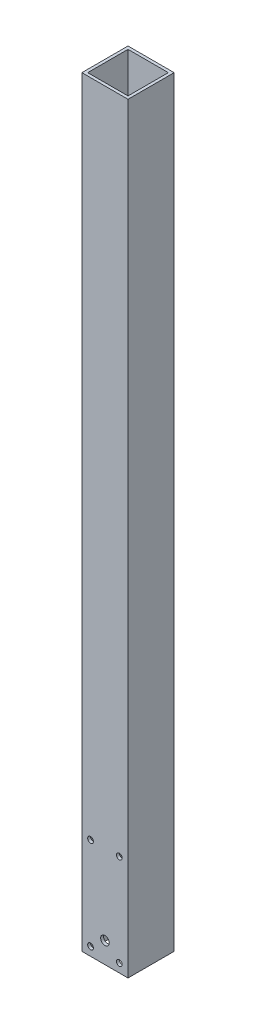
ISO-10303-21;
HEADER;
FILE_DESCRIPTION(('STEP AP214'),'2;1');
FILE_NAME('part.step','',(''),(''),'','','');
FILE_SCHEMA(('AUTOMOTIVE_DESIGN { 1 0 10303 214 1 1 1 1 }'));
ENDSEC;
DATA;
#1=APPLICATION_CONTEXT('core data for automotive mechanical design processes');
#2=APPLICATION_PROTOCOL_DEFINITION('international standard','automotive_design',2000,#1);
#3=PRODUCT_CONTEXT('',#1,'mechanical');
#4=PRODUCT('Part','Part','',(#3));
#5=PRODUCT_RELATED_PRODUCT_CATEGORY('part','',(#4));
#6=PRODUCT_DEFINITION_FORMATION('','',#4);
#7=PRODUCT_DEFINITION_CONTEXT('part definition',#1,'design');
#8=PRODUCT_DEFINITION('design','',#6,#7);
#9=PRODUCT_DEFINITION_SHAPE('','',#8);
#10=(LENGTH_UNIT() NAMED_UNIT(*) SI_UNIT(.MILLI.,.METRE.));
#11=(NAMED_UNIT(*) PLANE_ANGLE_UNIT() SI_UNIT($,.RADIAN.));
#12=(NAMED_UNIT(*) SI_UNIT($,.STERADIAN.) SOLID_ANGLE_UNIT());
#13=UNCERTAINTY_MEASURE_WITH_UNIT(LENGTH_MEASURE(1.E-05),#10,'distance_accuracy_value','');
#14=(GEOMETRIC_REPRESENTATION_CONTEXT(3) GLOBAL_UNCERTAINTY_ASSIGNED_CONTEXT((#13)) GLOBAL_UNIT_ASSIGNED_CONTEXT((#10,
#11,#12)) REPRESENTATION_CONTEXT('',''));
#15=CARTESIAN_POINT('',(0.,0.,0.));
#16=DIRECTION('',(0.,0.,1.));
#17=DIRECTION('',(1.,0.,0.));
#18=AXIS2_PLACEMENT_3D('',#15,#16,#17);
#19=CARTESIAN_POINT('',(0.,838.2,0.));
#20=DIRECTION('',(0.,-1.,0.));
#21=DIRECTION('',(0.,0.,-1.));
#22=AXIS2_PLACEMENT_3D('',#19,#20,#21);
#23=PLANE('',#22);
#24=DIRECTION('',(0.,0.,1.));
#25=VECTOR('',#24,1.);
#26=CARTESIAN_POINT('',(0.,838.2,0.));
#27=LINE('',#26,#25);
#28=CARTESIAN_POINT('',(0.,838.2,-50.8));
#29=VERTEX_POINT('',#28);
#30=CARTESIAN_POINT('',(0.,838.2,0.));
#31=VERTEX_POINT('',#30);
#32=EDGE_CURVE('E157',#29,#31,#27,.T.);
#33=ORIENTED_EDGE('',*,*,#32,.T.);
#34=DIRECTION('',(1.,0.,0.));
#35=VECTOR('',#34,1.);
#36=CARTESIAN_POINT('',(0.,838.2,0.));
#37=LINE('',#36,#35);
#38=CARTESIAN_POINT('',(50.8,838.2,0.));
#39=VERTEX_POINT('',#38);
#40=EDGE_CURVE('E161',#31,#39,#37,.T.);
#41=ORIENTED_EDGE('',*,*,#40,.T.);
#42=DIRECTION('',(0.,0.,-1.));
#43=VECTOR('',#42,1.);
#44=CARTESIAN_POINT('',(50.8,838.2,0.));
#45=LINE('',#44,#43);
#46=CARTESIAN_POINT('',(50.8,838.2,-50.8));
#47=VERTEX_POINT('',#46);
#48=EDGE_CURVE('E165',#39,#47,#45,.T.);
#49=ORIENTED_EDGE('',*,*,#48,.T.);
#50=DIRECTION('',(-1.,0.,0.));
#51=VECTOR('',#50,1.);
#52=CARTESIAN_POINT('',(0.,838.2,-50.8));
#53=LINE('',#52,#51);
#54=EDGE_CURVE('E168',#47,#29,#53,.T.);
#55=ORIENTED_EDGE('',*,*,#54,.T.);
#56=EDGE_LOOP('',(#33,#41,#49,#55));
#57=FACE_BOUND('',#56,.T.);
#58=DIRECTION('',(0.,0.,1.));
#59=VECTOR('',#58,1.);
#60=CARTESIAN_POINT('',(3.175,838.2,-3.175));
#61=LINE('',#60,#59);
#62=CARTESIAN_POINT('',(3.175,838.2,-47.625));
#63=VERTEX_POINT('',#62);
#64=CARTESIAN_POINT('',(3.175,838.2,-3.175));
#65=VERTEX_POINT('',#64);
#66=EDGE_CURVE('E107',#63,#65,#61,.T.);
#67=ORIENTED_EDGE('',*,*,#66,.F.);
#68=DIRECTION('',(-1.,0.,0.));
#69=VECTOR('',#68,1.);
#70=CARTESIAN_POINT('',(3.175,838.2,-47.625));
#71=LINE('',#70,#69);
#72=CARTESIAN_POINT('',(47.625,838.2,-47.625));
#73=VERTEX_POINT('',#72);
#74=EDGE_CURVE('E133',#73,#63,#71,.T.);
#75=ORIENTED_EDGE('',*,*,#74,.F.);
#76=DIRECTION('',(0.,0.,-1.));
#77=VECTOR('',#76,1.);
#78=CARTESIAN_POINT('',(47.625,838.2,-3.175));
#79=LINE('',#78,#77);
#80=CARTESIAN_POINT('',(47.625,838.2,-3.175));
#81=VERTEX_POINT('',#80);
#82=EDGE_CURVE('E129',#81,#73,#79,.T.);
#83=ORIENTED_EDGE('',*,*,#82,.F.);
#84=DIRECTION('',(1.,0.,0.));
#85=VECTOR('',#84,1.);
#86=CARTESIAN_POINT('',(3.175,838.2,-3.175));
#87=LINE('',#86,#85);
#88=EDGE_CURVE('E116',#65,#81,#87,.T.);
#89=ORIENTED_EDGE('',*,*,#88,.F.);
#90=EDGE_LOOP('',(#67,#75,#83,#89));
#91=FACE_BOUND('',#90,.T.);
#92=ADVANCED_FACE('F39',(#57,#91),#23,.F.);
#93=CARTESIAN_POINT('',(0.,0.,0.));
#94=DIRECTION('',(0.,-1.,0.));
#95=DIRECTION('',(0.,0.,-1.));
#96=AXIS2_PLACEMENT_3D('',#93,#94,#95);
#97=PLANE('',#96);
#98=DIRECTION('',(0.,0.,1.));
#99=VECTOR('',#98,1.);
#100=CARTESIAN_POINT('',(0.,0.,0.));
#101=LINE('',#100,#99);
#102=CARTESIAN_POINT('',(0.,0.,-50.8));
#103=VERTEX_POINT('',#102);
#104=CARTESIAN_POINT('',(0.,0.,0.));
#105=VERTEX_POINT('',#104);
#106=EDGE_CURVE('E125',#103,#105,#101,.T.);
#107=ORIENTED_EDGE('',*,*,#106,.F.);
#108=DIRECTION('',(-1.,0.,0.));
#109=VECTOR('',#108,1.);
#110=CARTESIAN_POINT('',(0.,0.,-50.8));
#111=LINE('',#110,#109);
#112=CARTESIAN_POINT('',(50.8,0.,-50.8));
#113=VERTEX_POINT('',#112);
#114=EDGE_CURVE('E162',#113,#103,#111,.T.);
#115=ORIENTED_EDGE('',*,*,#114,.F.);
#116=DIRECTION('',(0.,0.,-1.));
#117=VECTOR('',#116,1.);
#118=CARTESIAN_POINT('',(50.8,0.,0.));
#119=LINE('',#118,#117);
#120=CARTESIAN_POINT('',(50.8,0.,0.));
#121=VERTEX_POINT('',#120);
#122=EDGE_CURVE('E178',#121,#113,#119,.T.);
#123=ORIENTED_EDGE('',*,*,#122,.F.);
#124=DIRECTION('',(1.,0.,0.));
#125=VECTOR('',#124,1.);
#126=CARTESIAN_POINT('',(0.,0.,0.));
#127=LINE('',#126,#125);
#128=EDGE_CURVE('E175',#105,#121,#127,.T.);
#129=ORIENTED_EDGE('',*,*,#128,.F.);
#130=EDGE_LOOP('',(#107,#115,#123,#129));
#131=FACE_BOUND('',#130,.T.);
#132=DIRECTION('',(-1.,0.,0.));
#133=VECTOR('',#132,1.);
#134=CARTESIAN_POINT('',(3.175,0.,-47.625));
#135=LINE('',#134,#133);
#136=CARTESIAN_POINT('',(47.625,0.,-47.625));
#137=VERTEX_POINT('',#136);
#138=CARTESIAN_POINT('',(3.175,0.,-47.625));
#139=VERTEX_POINT('',#138);
#140=EDGE_CURVE('E117',#137,#139,#135,.T.);
#141=ORIENTED_EDGE('',*,*,#140,.T.);
#142=DIRECTION('',(0.,0.,1.));
#143=VECTOR('',#142,1.);
#144=CARTESIAN_POINT('',(3.175,0.,-3.175));
#145=LINE('',#144,#143);
#146=CARTESIAN_POINT('',(3.175,0.,-3.175));
#147=VERTEX_POINT('',#146);
#148=EDGE_CURVE('E65',#139,#147,#145,.T.);
#149=ORIENTED_EDGE('',*,*,#148,.T.);
#150=DIRECTION('',(1.,0.,0.));
#151=VECTOR('',#150,1.);
#152=CARTESIAN_POINT('',(3.175,0.,-3.175));
#153=LINE('',#152,#151);
#154=CARTESIAN_POINT('',(47.625,0.,-3.175));
#155=VERTEX_POINT('',#154);
#156=EDGE_CURVE('E123',#147,#155,#153,.T.);
#157=ORIENTED_EDGE('',*,*,#156,.T.);
#158=DIRECTION('',(0.,0.,-1.));
#159=VECTOR('',#158,1.);
#160=CARTESIAN_POINT('',(47.625,0.,-3.175));
#161=LINE('',#160,#159);
#162=EDGE_CURVE('E144',#155,#137,#161,.T.);
#163=ORIENTED_EDGE('',*,*,#162,.T.);
#164=EDGE_LOOP('',(#141,#149,#157,#163));
#165=FACE_BOUND('',#164,.T.);
#166=ADVANCED_FACE('F249',(#131,#165),#97,.T.);
#167=CARTESIAN_POINT('',(0.,838.2,0.));
#168=DIRECTION('',(1.,0.,0.));
#169=DIRECTION('',(0.,0.,-1.));
#170=AXIS2_PLACEMENT_3D('',#167,#168,#169);
#171=PLANE('',#170);
#172=ORIENTED_EDGE('',*,*,#106,.T.);
#173=DIRECTION('',(0.,-1.,0.));
#174=VECTOR('',#173,1.);
#175=CARTESIAN_POINT('',(0.,838.2,0.));
#176=LINE('',#175,#174);
#177=EDGE_CURVE('E11',#31,#105,#176,.T.);
#178=ORIENTED_EDGE('',*,*,#177,.F.);
#179=ORIENTED_EDGE('',*,*,#32,.F.);
#180=DIRECTION('',(0.,-1.,0.));
#181=VECTOR('',#180,1.);
#182=CARTESIAN_POINT('',(0.,838.2,-50.8));
#183=LINE('',#182,#181);
#184=EDGE_CURVE('E171',#29,#103,#183,.T.);
#185=ORIENTED_EDGE('',*,*,#184,.T.);
#186=EDGE_LOOP('',(#172,#178,#179,#185));
#187=FACE_BOUND('',#186,.T.);
#188=ADVANCED_FACE('F41',(#187),#171,.F.);
#189=CARTESIAN_POINT('',(0.,838.2,0.));
#190=DIRECTION('',(0.,0.,-1.));
#191=DIRECTION('',(-1.,0.,0.));
#192=AXIS2_PLACEMENT_3D('',#189,#190,#191);
#193=PLANE('',#192);
#194=CARTESIAN_POINT('',(41.275,111.125,0.));
#195=DIRECTION('',(0.,0.,1.));
#196=DIRECTION('',(1.,0.,0.));
#197=AXIS2_PLACEMENT_3D('',#194,#195,#196);
#198=CIRCLE('',#197,3.175);
#199=CARTESIAN_POINT('',(44.45,111.125,0.));
#200=VERTEX_POINT('',#199);
#201=EDGE_CURVE('E285',#200,#200,#198,.T.);
#202=ORIENTED_EDGE('',*,*,#201,.F.);
#203=EDGE_LOOP('',(#202));
#204=FACE_BOUND('',#203,.T.);
#205=CARTESIAN_POINT('',(9.525,9.525,0.));
#206=DIRECTION('',(0.,0.,1.));
#207=DIRECTION('',(1.,0.,0.));
#208=AXIS2_PLACEMENT_3D('',#205,#206,#207);
#209=CIRCLE('',#208,3.175);
#210=CARTESIAN_POINT('',(12.7,9.525,0.));
#211=VERTEX_POINT('',#210);
#212=EDGE_CURVE('E289',#211,#211,#209,.T.);
#213=ORIENTED_EDGE('',*,*,#212,.F.);
#214=EDGE_LOOP('',(#213));
#215=FACE_BOUND('',#214,.T.);
#216=CARTESIAN_POINT('',(41.275,9.525,0.));
#217=DIRECTION('',(0.,0.,1.));
#218=DIRECTION('',(1.,0.,0.));
#219=AXIS2_PLACEMENT_3D('',#216,#217,#218);
#220=CIRCLE('',#219,3.175);
#221=CARTESIAN_POINT('',(44.45,9.525,0.));
#222=VERTEX_POINT('',#221);
#223=EDGE_CURVE('E293',#222,#222,#220,.T.);
#224=ORIENTED_EDGE('',*,*,#223,.F.);
#225=EDGE_LOOP('',(#224));
#226=FACE_BOUND('',#225,.T.);
#227=CARTESIAN_POINT('',(25.4,23.114,0.));
#228=DIRECTION('',(0.,0.,1.));
#229=DIRECTION('',(1.,0.,0.));
#230=AXIS2_PLACEMENT_3D('',#227,#228,#229);
#231=CIRCLE('',#230,4.7625);
#232=CARTESIAN_POINT('',(30.1625,23.114,0.));
#233=VERTEX_POINT('',#232);
#234=EDGE_CURVE('E297',#233,#233,#231,.T.);
#235=ORIENTED_EDGE('',*,*,#234,.F.);
#236=EDGE_LOOP('',(#235));
#237=FACE_BOUND('',#236,.T.);
#238=CARTESIAN_POINT('',(9.525,111.125,0.));
#239=DIRECTION('',(0.,0.,1.));
#240=DIRECTION('',(1.,0.,0.));
#241=AXIS2_PLACEMENT_3D('',#238,#239,#240);
#242=CIRCLE('',#241,3.175);
#243=CARTESIAN_POINT('',(12.7,111.125,0.));
#244=VERTEX_POINT('',#243);
#245=EDGE_CURVE('E301',#244,#244,#242,.T.);
#246=ORIENTED_EDGE('',*,*,#245,.F.);
#247=EDGE_LOOP('',(#246));
#248=FACE_BOUND('',#247,.T.);
#249=ORIENTED_EDGE('',*,*,#128,.T.);
#250=DIRECTION('',(0.,-1.,0.));
#251=VECTOR('',#250,1.);
#252=CARTESIAN_POINT('',(50.8,838.2,0.));
#253=LINE('',#252,#251);
#254=EDGE_CURVE('E49',#39,#121,#253,.T.);
#255=ORIENTED_EDGE('',*,*,#254,.F.);
#256=ORIENTED_EDGE('',*,*,#40,.F.);
#257=ORIENTED_EDGE('',*,*,#177,.T.);
#258=EDGE_LOOP('',(#249,#255,#256,#257));
#259=FACE_BOUND('',#258,.T.);
#260=ADVANCED_FACE('F274',(#204,#215,#226,#237,#248,#259),#193,.F.);
#261=CARTESIAN_POINT('',(50.8,838.2,0.));
#262=DIRECTION('',(-1.,0.,0.));
#263=DIRECTION('',(0.,0.,1.));
#264=AXIS2_PLACEMENT_3D('',#261,#262,#263);
#265=PLANE('',#264);
#266=ORIENTED_EDGE('',*,*,#122,.T.);
#267=DIRECTION('',(0.,-1.,0.));
#268=VECTOR('',#267,1.);
#269=CARTESIAN_POINT('',(50.8,838.2,-50.8));
#270=LINE('',#269,#268);
#271=EDGE_CURVE('E186',#47,#113,#270,.T.);
#272=ORIENTED_EDGE('',*,*,#271,.F.);
#273=ORIENTED_EDGE('',*,*,#48,.F.);
#274=ORIENTED_EDGE('',*,*,#254,.T.);
#275=EDGE_LOOP('',(#266,#272,#273,#274));
#276=FACE_BOUND('',#275,.T.);
#277=ADVANCED_FACE('F271',(#276),#265,.F.);
#278=CARTESIAN_POINT('',(0.,838.2,-50.8));
#279=DIRECTION('',(0.,0.,1.));
#280=DIRECTION('',(1.,0.,0.));
#281=AXIS2_PLACEMENT_3D('',#278,#279,#280);
#282=PLANE('',#281);
#283=CARTESIAN_POINT('',(41.275,111.125,-50.8));
#284=DIRECTION('',(0.,0.,1.));
#285=DIRECTION('',(1.,0.,0.));
#286=AXIS2_PLACEMENT_3D('',#283,#284,#285);
#287=CIRCLE('',#286,3.175);
#288=CARTESIAN_POINT('',(44.45,111.125,-50.8));
#289=VERTEX_POINT('',#288);
#290=EDGE_CURVE('E315',#289,#289,#287,.T.);
#291=ORIENTED_EDGE('',*,*,#290,.T.);
#292=EDGE_LOOP('',(#291));
#293=FACE_BOUND('',#292,.T.);
#294=CARTESIAN_POINT('',(9.525,9.525,-50.8));
#295=DIRECTION('',(0.,0.,1.));
#296=DIRECTION('',(1.,0.,0.));
#297=AXIS2_PLACEMENT_3D('',#294,#295,#296);
#298=CIRCLE('',#297,3.175);
#299=CARTESIAN_POINT('',(12.7,9.525,-50.8));
#300=VERTEX_POINT('',#299);
#301=EDGE_CURVE('E375',#300,#300,#298,.T.);
#302=ORIENTED_EDGE('',*,*,#301,.T.);
#303=EDGE_LOOP('',(#302));
#304=FACE_BOUND('',#303,.T.);
#305=CARTESIAN_POINT('',(41.275,9.525,-50.8));
#306=DIRECTION('',(0.,0.,1.));
#307=DIRECTION('',(1.,0.,0.));
#308=AXIS2_PLACEMENT_3D('',#305,#306,#307);
#309=CIRCLE('',#308,3.175);
#310=CARTESIAN_POINT('',(44.45,9.525,-50.8));
#311=VERTEX_POINT('',#310);
#312=EDGE_CURVE('E376',#311,#311,#309,.T.);
#313=ORIENTED_EDGE('',*,*,#312,.T.);
#314=EDGE_LOOP('',(#313));
#315=FACE_BOUND('',#314,.T.);
#316=CARTESIAN_POINT('',(25.4,23.114,-50.8));
#317=DIRECTION('',(0.,0.,1.));
#318=DIRECTION('',(1.,0.,0.));
#319=AXIS2_PLACEMENT_3D('',#316,#317,#318);
#320=CIRCLE('',#319,4.7625);
#321=CARTESIAN_POINT('',(30.1625,23.114,-50.8));
#322=VERTEX_POINT('',#321);
#323=EDGE_CURVE('E388',#322,#322,#320,.T.);
#324=ORIENTED_EDGE('',*,*,#323,.T.);
#325=EDGE_LOOP('',(#324));
#326=FACE_BOUND('',#325,.T.);
#327=CARTESIAN_POINT('',(9.525,111.125,-50.8));
#328=DIRECTION('',(0.,0.,1.));
#329=DIRECTION('',(1.,0.,0.));
#330=AXIS2_PLACEMENT_3D('',#327,#328,#329);
#331=CIRCLE('',#330,3.175);
#332=CARTESIAN_POINT('',(12.7,111.125,-50.8));
#333=VERTEX_POINT('',#332);
#334=EDGE_CURVE('E198',#333,#333,#331,.T.);
#335=ORIENTED_EDGE('',*,*,#334,.T.);
#336=EDGE_LOOP('',(#335));
#337=FACE_BOUND('',#336,.T.);
#338=ORIENTED_EDGE('',*,*,#114,.T.);
#339=ORIENTED_EDGE('',*,*,#184,.F.);
#340=ORIENTED_EDGE('',*,*,#54,.F.);
#341=ORIENTED_EDGE('',*,*,#271,.T.);
#342=EDGE_LOOP('',(#338,#339,#340,#341));
#343=FACE_BOUND('',#342,.T.);
#344=ADVANCED_FACE('F268',(#293,#304,#315,#326,#337,#343),#282,.F.);
#345=CARTESIAN_POINT('',(3.175,838.2,-3.175));
#346=DIRECTION('',(1.,0.,0.));
#347=DIRECTION('',(0.,0.,-1.));
#348=AXIS2_PLACEMENT_3D('',#345,#346,#347);
#349=PLANE('',#348);
#350=ORIENTED_EDGE('',*,*,#148,.F.);
#351=DIRECTION('',(0.,-1.,0.));
#352=VECTOR('',#351,1.);
#353=CARTESIAN_POINT('',(3.175,838.2,-47.625));
#354=LINE('',#353,#352);
#355=EDGE_CURVE('E111',#63,#139,#354,.T.);
#356=ORIENTED_EDGE('',*,*,#355,.F.);
#357=ORIENTED_EDGE('',*,*,#66,.T.);
#358=DIRECTION('',(0.,-1.,0.));
#359=VECTOR('',#358,1.);
#360=CARTESIAN_POINT('',(3.175,838.2,-3.175));
#361=LINE('',#360,#359);
#362=EDGE_CURVE('E110',#65,#147,#361,.T.);
#363=ORIENTED_EDGE('',*,*,#362,.T.);
#364=EDGE_LOOP('',(#350,#356,#357,#363));
#365=FACE_BOUND('',#364,.T.);
#366=ADVANCED_FACE('F109',(#365),#349,.T.);
#367=CARTESIAN_POINT('',(3.175,838.2,-3.175));
#368=DIRECTION('',(0.,0.,-1.));
#369=DIRECTION('',(-1.,0.,0.));
#370=AXIS2_PLACEMENT_3D('',#367,#368,#369);
#371=PLANE('',#370);
#372=CARTESIAN_POINT('',(41.275,111.125,-3.175));
#373=DIRECTION('',(0.,0.,-1.));
#374=DIRECTION('',(-1.,0.,0.));
#375=AXIS2_PLACEMENT_3D('',#372,#373,#374);
#376=CIRCLE('',#375,3.175);
#377=CARTESIAN_POINT('',(38.1,111.125,-3.175));
#378=VERTEX_POINT('',#377);
#379=EDGE_CURVE('E141',#378,#378,#376,.T.);
#380=ORIENTED_EDGE('',*,*,#379,.F.);
#381=EDGE_LOOP('',(#380));
#382=FACE_BOUND('',#381,.T.);
#383=CARTESIAN_POINT('',(9.525,9.525,-3.175));
#384=DIRECTION('',(0.,0.,-1.));
#385=DIRECTION('',(-1.,0.,0.));
#386=AXIS2_PLACEMENT_3D('',#383,#384,#385);
#387=CIRCLE('',#386,3.175);
#388=CARTESIAN_POINT('',(6.35,9.525,-3.175));
#389=VERTEX_POINT('',#388);
#390=EDGE_CURVE('E211',#389,#389,#387,.T.);
#391=ORIENTED_EDGE('',*,*,#390,.F.);
#392=EDGE_LOOP('',(#391));
#393=FACE_BOUND('',#392,.T.);
#394=CARTESIAN_POINT('',(41.275,9.525,-3.175));
#395=DIRECTION('',(0.,0.,-1.));
#396=DIRECTION('',(-1.,0.,0.));
#397=AXIS2_PLACEMENT_3D('',#394,#395,#396);
#398=CIRCLE('',#397,3.175);
#399=CARTESIAN_POINT('',(38.1,9.525,-3.175));
#400=VERTEX_POINT('',#399);
#401=EDGE_CURVE('E207',#400,#400,#398,.T.);
#402=ORIENTED_EDGE('',*,*,#401,.F.);
#403=EDGE_LOOP('',(#402));
#404=FACE_BOUND('',#403,.T.);
#405=CARTESIAN_POINT('',(25.4,23.114,-3.175));
#406=DIRECTION('',(0.,0.,-1.));
#407=DIRECTION('',(-1.,0.,0.));
#408=AXIS2_PLACEMENT_3D('',#405,#406,#407);
#409=CIRCLE('',#408,4.7625);
#410=CARTESIAN_POINT('',(20.6375,23.114,-3.175));
#411=VERTEX_POINT('',#410);
#412=EDGE_CURVE('E203',#411,#411,#409,.T.);
#413=ORIENTED_EDGE('',*,*,#412,.F.);
#414=EDGE_LOOP('',(#413));
#415=FACE_BOUND('',#414,.T.);
#416=CARTESIAN_POINT('',(9.525,111.125,-3.175));
#417=DIRECTION('',(0.,0.,-1.));
#418=DIRECTION('',(-1.,0.,0.));
#419=AXIS2_PLACEMENT_3D('',#416,#417,#418);
#420=CIRCLE('',#419,3.175);
#421=CARTESIAN_POINT('',(6.35,111.125,-3.175));
#422=VERTEX_POINT('',#421);
#423=EDGE_CURVE('E197',#422,#422,#420,.T.);
#424=ORIENTED_EDGE('',*,*,#423,.F.);
#425=EDGE_LOOP('',(#424));
#426=FACE_BOUND('',#425,.T.);
#427=ORIENTED_EDGE('',*,*,#156,.F.);
#428=ORIENTED_EDGE('',*,*,#362,.F.);
#429=ORIENTED_EDGE('',*,*,#88,.T.);
#430=DIRECTION('',(0.,-1.,0.));
#431=VECTOR('',#430,1.);
#432=CARTESIAN_POINT('',(47.625,838.2,-3.175));
#433=LINE('',#432,#431);
#434=EDGE_CURVE('E126',#81,#155,#433,.T.);
#435=ORIENTED_EDGE('',*,*,#434,.T.);
#436=EDGE_LOOP('',(#427,#428,#429,#435));
#437=FACE_BOUND('',#436,.T.);
#438=ADVANCED_FACE('F120',(#382,#393,#404,#415,#426,#437),#371,.T.);
#439=CARTESIAN_POINT('',(47.625,838.2,-3.175));
#440=DIRECTION('',(-1.,0.,0.));
#441=DIRECTION('',(0.,0.,1.));
#442=AXIS2_PLACEMENT_3D('',#439,#440,#441);
#443=PLANE('',#442);
#444=ORIENTED_EDGE('',*,*,#162,.F.);
#445=ORIENTED_EDGE('',*,*,#434,.F.);
#446=ORIENTED_EDGE('',*,*,#82,.T.);
#447=DIRECTION('',(0.,-1.,0.));
#448=VECTOR('',#447,1.);
#449=CARTESIAN_POINT('',(47.625,838.2,-47.625));
#450=LINE('',#449,#448);
#451=EDGE_CURVE('E57',#73,#137,#450,.T.);
#452=ORIENTED_EDGE('',*,*,#451,.T.);
#453=EDGE_LOOP('',(#444,#445,#446,#452));
#454=FACE_BOUND('',#453,.T.);
#455=ADVANCED_FACE('F239',(#454),#443,.T.);
#456=CARTESIAN_POINT('',(3.175,838.2,-47.625));
#457=DIRECTION('',(0.,0.,1.));
#458=DIRECTION('',(1.,0.,0.));
#459=AXIS2_PLACEMENT_3D('',#456,#457,#458);
#460=PLANE('',#459);
#461=CARTESIAN_POINT('',(41.275,111.125,-47.625));
#462=DIRECTION('',(0.,0.,1.));
#463=DIRECTION('',(1.,0.,0.));
#464=AXIS2_PLACEMENT_3D('',#461,#462,#463);
#465=CIRCLE('',#464,3.175);
#466=CARTESIAN_POINT('',(44.45,111.125,-47.625));
#467=VERTEX_POINT('',#466);
#468=EDGE_CURVE('E43',#467,#467,#465,.T.);
#469=ORIENTED_EDGE('',*,*,#468,.F.);
#470=EDGE_LOOP('',(#469));
#471=FACE_BOUND('',#470,.T.);
#472=CARTESIAN_POINT('',(9.525,9.525,-47.625));
#473=DIRECTION('',(0.,0.,1.));
#474=DIRECTION('',(1.,0.,0.));
#475=AXIS2_PLACEMENT_3D('',#472,#473,#474);
#476=CIRCLE('',#475,3.175);
#477=CARTESIAN_POINT('',(12.7,9.525,-47.625));
#478=VERTEX_POINT('',#477);
#479=EDGE_CURVE('E208',#478,#478,#476,.T.);
#480=ORIENTED_EDGE('',*,*,#479,.F.);
#481=EDGE_LOOP('',(#480));
#482=FACE_BOUND('',#481,.T.);
#483=CARTESIAN_POINT('',(41.275,9.525,-47.625));
#484=DIRECTION('',(0.,0.,1.));
#485=DIRECTION('',(1.,0.,0.));
#486=AXIS2_PLACEMENT_3D('',#483,#484,#485);
#487=CIRCLE('',#486,3.175);
#488=CARTESIAN_POINT('',(44.45,9.525,-47.625));
#489=VERTEX_POINT('',#488);
#490=EDGE_CURVE('E204',#489,#489,#487,.T.);
#491=ORIENTED_EDGE('',*,*,#490,.F.);
#492=EDGE_LOOP('',(#491));
#493=FACE_BOUND('',#492,.T.);
#494=CARTESIAN_POINT('',(25.4,23.114,-47.625));
#495=DIRECTION('',(0.,0.,1.));
#496=DIRECTION('',(1.,0.,0.));
#497=AXIS2_PLACEMENT_3D('',#494,#495,#496);
#498=CIRCLE('',#497,4.7625);
#499=CARTESIAN_POINT('',(30.1625,23.114,-47.625));
#500=VERTEX_POINT('',#499);
#501=EDGE_CURVE('E199',#500,#500,#498,.T.);
#502=ORIENTED_EDGE('',*,*,#501,.F.);
#503=EDGE_LOOP('',(#502));
#504=FACE_BOUND('',#503,.T.);
#505=CARTESIAN_POINT('',(9.525,111.125,-47.625));
#506=DIRECTION('',(0.,0.,1.));
#507=DIRECTION('',(1.,0.,0.));
#508=AXIS2_PLACEMENT_3D('',#505,#506,#507);
#509=CIRCLE('',#508,3.175);
#510=CARTESIAN_POINT('',(12.7,111.125,-47.625));
#511=VERTEX_POINT('',#510);
#512=EDGE_CURVE('E193',#511,#511,#509,.T.);
#513=ORIENTED_EDGE('',*,*,#512,.F.);
#514=EDGE_LOOP('',(#513));
#515=FACE_BOUND('',#514,.T.);
#516=ORIENTED_EDGE('',*,*,#140,.F.);
#517=ORIENTED_EDGE('',*,*,#451,.F.);
#518=ORIENTED_EDGE('',*,*,#74,.T.);
#519=ORIENTED_EDGE('',*,*,#355,.T.);
#520=EDGE_LOOP('',(#516,#517,#518,#519));
#521=FACE_BOUND('',#520,.T.);
#522=ADVANCED_FACE('F235',(#471,#482,#493,#504,#515,#521),#460,.T.);
#523=CARTESIAN_POINT('',(9.525,111.125,-50.8));
#524=DIRECTION('',(0.,0.,1.));
#525=DIRECTION('',(1.,0.,0.));
#526=AXIS2_PLACEMENT_3D('',#523,#524,#525);
#527=CYLINDRICAL_SURFACE('',#526,3.175);
#528=ORIENTED_EDGE('',*,*,#512,.T.);
#529=EDGE_LOOP('',(#528));
#530=FACE_BOUND('',#529,.T.);
#531=ORIENTED_EDGE('',*,*,#334,.F.);
#532=EDGE_LOOP('',(#531));
#533=FACE_BOUND('',#532,.T.);
#534=ADVANCED_FACE('F238',(#530,#533),#527,.F.);
#535=CARTESIAN_POINT('',(25.4,23.114,-50.8));
#536=DIRECTION('',(0.,0.,1.));
#537=DIRECTION('',(1.,0.,0.));
#538=AXIS2_PLACEMENT_3D('',#535,#536,#537);
#539=CYLINDRICAL_SURFACE('',#538,4.7625);
#540=ORIENTED_EDGE('',*,*,#501,.T.);
#541=EDGE_LOOP('',(#540));
#542=FACE_BOUND('',#541,.T.);
#543=ORIENTED_EDGE('',*,*,#323,.F.);
#544=EDGE_LOOP('',(#543));
#545=FACE_BOUND('',#544,.T.);
#546=ADVANCED_FACE('F340',(#542,#545),#539,.F.);
#547=CARTESIAN_POINT('',(41.275,9.525,-50.8));
#548=DIRECTION('',(0.,0.,1.));
#549=DIRECTION('',(1.,0.,0.));
#550=AXIS2_PLACEMENT_3D('',#547,#548,#549);
#551=CYLINDRICAL_SURFACE('',#550,3.175);
#552=ORIENTED_EDGE('',*,*,#490,.T.);
#553=EDGE_LOOP('',(#552));
#554=FACE_BOUND('',#553,.T.);
#555=ORIENTED_EDGE('',*,*,#312,.F.);
#556=EDGE_LOOP('',(#555));
#557=FACE_BOUND('',#556,.T.);
#558=ADVANCED_FACE('F350',(#554,#557),#551,.F.);
#559=CARTESIAN_POINT('',(9.525,9.525,-50.8));
#560=DIRECTION('',(0.,0.,1.));
#561=DIRECTION('',(1.,0.,0.));
#562=AXIS2_PLACEMENT_3D('',#559,#560,#561);
#563=CYLINDRICAL_SURFACE('',#562,3.175);
#564=ORIENTED_EDGE('',*,*,#479,.T.);
#565=EDGE_LOOP('',(#564));
#566=FACE_BOUND('',#565,.T.);
#567=ORIENTED_EDGE('',*,*,#301,.F.);
#568=EDGE_LOOP('',(#567));
#569=FACE_BOUND('',#568,.T.);
#570=ADVANCED_FACE('F341',(#566,#569),#563,.F.);
#571=CARTESIAN_POINT('',(41.275,111.125,-50.8));
#572=DIRECTION('',(0.,0.,1.));
#573=DIRECTION('',(1.,0.,0.));
#574=AXIS2_PLACEMENT_3D('',#571,#572,#573);
#575=CYLINDRICAL_SURFACE('',#574,3.175);
#576=ORIENTED_EDGE('',*,*,#468,.T.);
#577=EDGE_LOOP('',(#576));
#578=FACE_BOUND('',#577,.T.);
#579=ORIENTED_EDGE('',*,*,#290,.F.);
#580=EDGE_LOOP('',(#579));
#581=FACE_BOUND('',#580,.T.);
#582=ADVANCED_FACE('F232',(#578,#581),#575,.F.);
#583=ORIENTED_EDGE('',*,*,#423,.T.);
#584=EDGE_LOOP('',(#583));
#585=FACE_BOUND('',#584,.T.);
#586=ORIENTED_EDGE('',*,*,#245,.T.);
#587=EDGE_LOOP('',(#586));
#588=FACE_BOUND('',#587,.T.);
#589=ADVANCED_FACE('F328',(#585,#588),#527,.F.);
#590=ORIENTED_EDGE('',*,*,#412,.T.);
#591=EDGE_LOOP('',(#590));
#592=FACE_BOUND('',#591,.T.);
#593=ORIENTED_EDGE('',*,*,#234,.T.);
#594=EDGE_LOOP('',(#593));
#595=FACE_BOUND('',#594,.T.);
#596=ADVANCED_FACE('F331',(#592,#595),#539,.F.);
#597=ORIENTED_EDGE('',*,*,#401,.T.);
#598=EDGE_LOOP('',(#597));
#599=FACE_BOUND('',#598,.T.);
#600=ORIENTED_EDGE('',*,*,#223,.T.);
#601=EDGE_LOOP('',(#600));
#602=FACE_BOUND('',#601,.T.);
#603=ADVANCED_FACE('F337',(#599,#602),#551,.F.);
#604=ORIENTED_EDGE('',*,*,#390,.T.);
#605=EDGE_LOOP('',(#604));
#606=FACE_BOUND('',#605,.T.);
#607=ORIENTED_EDGE('',*,*,#212,.T.);
#608=EDGE_LOOP('',(#607));
#609=FACE_BOUND('',#608,.T.);
#610=ADVANCED_FACE('F362',(#606,#609),#563,.F.);
#611=ORIENTED_EDGE('',*,*,#379,.T.);
#612=EDGE_LOOP('',(#611));
#613=FACE_BOUND('',#612,.T.);
#614=ORIENTED_EDGE('',*,*,#201,.T.);
#615=EDGE_LOOP('',(#614));
#616=FACE_BOUND('',#615,.T.);
#617=ADVANCED_FACE('F343',(#613,#616),#575,.F.);
#618=CLOSED_SHELL('',(#92,#166,#188,#260,#277,#344,#366,#438,#455,#522,#534,#546,#558,#570,#582,
#589,#596,#603,#610,#617));
#619=MANIFOLD_SOLID_BREP('B2',#618);
#620=ADVANCED_BREP_SHAPE_REPRESENTATION('',(#18,#619),#14);
#621=SHAPE_DEFINITION_REPRESENTATION(#9,#620);
ENDSEC;
END-ISO-10303-21;
